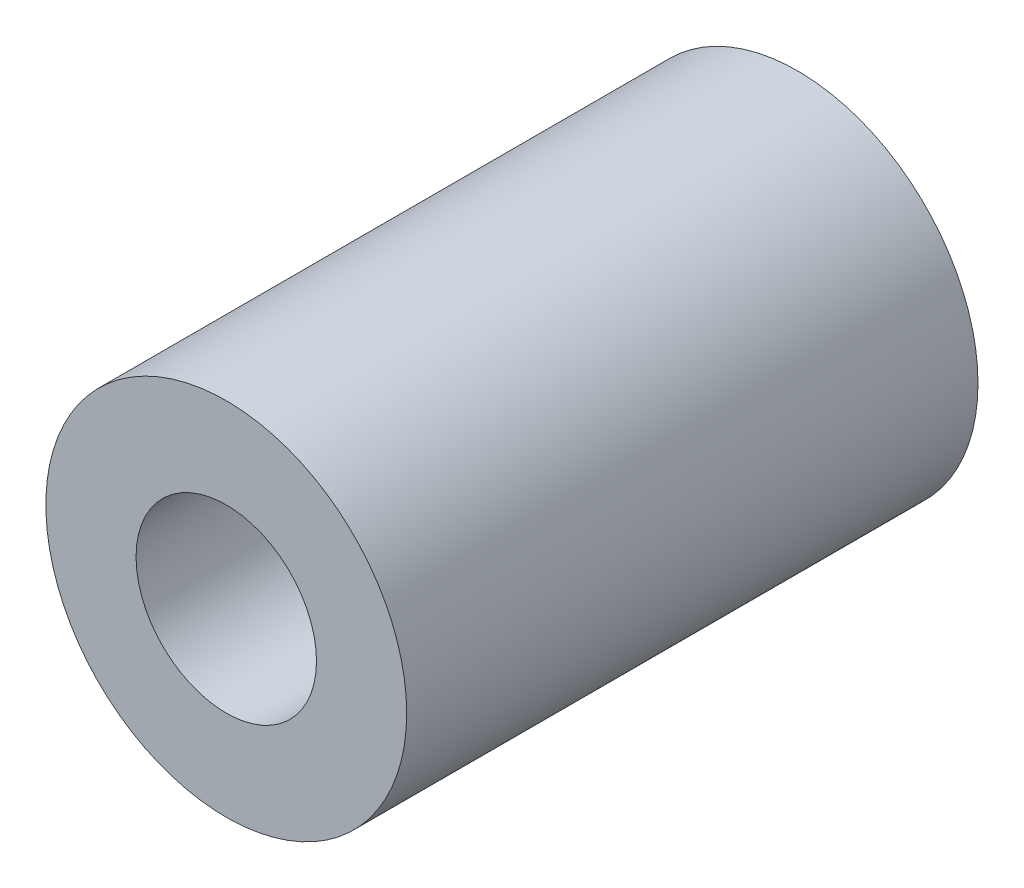
ISO-10303-21;
HEADER;
FILE_DESCRIPTION(('STEP AP214'),'2;1');
FILE_NAME('part.step','',(''),(''),'','','');
FILE_SCHEMA(('AUTOMOTIVE_DESIGN { 1 0 10303 214 1 1 1 1 }'));
ENDSEC;
DATA;
#1=APPLICATION_CONTEXT('core data for automotive mechanical design processes');
#2=APPLICATION_PROTOCOL_DEFINITION('international standard','automotive_design',2000,#1);
#3=PRODUCT_CONTEXT('',#1,'mechanical');
#4=PRODUCT('Part','Part','',(#3));
#5=PRODUCT_RELATED_PRODUCT_CATEGORY('part','',(#4));
#6=PRODUCT_DEFINITION_FORMATION('','',#4);
#7=PRODUCT_DEFINITION_CONTEXT('part definition',#1,'design');
#8=PRODUCT_DEFINITION('design','',#6,#7);
#9=PRODUCT_DEFINITION_SHAPE('','',#8);
#10=(LENGTH_UNIT() NAMED_UNIT(*) SI_UNIT(.MILLI.,.METRE.));
#11=(NAMED_UNIT(*) PLANE_ANGLE_UNIT() SI_UNIT($,.RADIAN.));
#12=(NAMED_UNIT(*) SI_UNIT($,.STERADIAN.) SOLID_ANGLE_UNIT());
#13=UNCERTAINTY_MEASURE_WITH_UNIT(LENGTH_MEASURE(1.E-05),#10,'distance_accuracy_value','');
#14=(GEOMETRIC_REPRESENTATION_CONTEXT(3) GLOBAL_UNCERTAINTY_ASSIGNED_CONTEXT((#13)) GLOBAL_UNIT_ASSIGNED_CONTEXT((#10,
#11,#12)) REPRESENTATION_CONTEXT('',''));
#15=CARTESIAN_POINT('',(0.,0.,0.));
#16=DIRECTION('',(0.,0.,1.));
#17=DIRECTION('',(1.,0.,0.));
#18=AXIS2_PLACEMENT_3D('',#15,#16,#17);
#19=CARTESIAN_POINT('',(0.,0.,19.));
#20=DIRECTION('',(0.,0.,1.));
#21=DIRECTION('',(1.,0.,0.));
#22=AXIS2_PLACEMENT_3D('',#19,#20,#21);
#23=PLANE('',#22);
#24=CARTESIAN_POINT('',(0.,0.,19.));
#25=DIRECTION('',(0.,0.,1.));
#26=DIRECTION('',(1.,0.,0.));
#27=AXIS2_PLACEMENT_3D('',#24,#25,#26);
#28=CIRCLE('',#27,6.);
#29=CARTESIAN_POINT('',(6.,0.,19.));
#30=VERTEX_POINT('',#29);
#31=EDGE_CURVE('E10',#30,#30,#28,.T.);
#32=ORIENTED_EDGE('',*,*,#31,.T.);
#33=EDGE_LOOP('',(#32));
#34=FACE_BOUND('',#33,.T.);
#35=CARTESIAN_POINT('',(0.,0.,19.));
#36=DIRECTION('',(0.,0.,1.));
#37=DIRECTION('',(1.,0.,0.));
#38=AXIS2_PLACEMENT_3D('',#35,#36,#37);
#39=CIRCLE('',#38,3.);
#40=CARTESIAN_POINT('',(3.,0.,19.));
#41=VERTEX_POINT('',#40);
#42=EDGE_CURVE('E48',#41,#41,#39,.T.);
#43=ORIENTED_EDGE('',*,*,#42,.F.);
#44=EDGE_LOOP('',(#43));
#45=FACE_BOUND('',#44,.T.);
#46=ADVANCED_FACE('F37',(#34,#45),#23,.T.);
#47=CARTESIAN_POINT('',(0.,0.,0.));
#48=DIRECTION('',(0.,0.,1.));
#49=DIRECTION('',(1.,0.,0.));
#50=AXIS2_PLACEMENT_3D('',#47,#48,#49);
#51=PLANE('',#50);
#52=CARTESIAN_POINT('',(0.,0.,0.));
#53=DIRECTION('',(0.,0.,1.));
#54=DIRECTION('',(1.,0.,0.));
#55=AXIS2_PLACEMENT_3D('',#52,#53,#54);
#56=CIRCLE('',#55,6.);
#57=CARTESIAN_POINT('',(6.,0.,0.));
#58=VERTEX_POINT('',#57);
#59=EDGE_CURVE('E41',#58,#58,#56,.T.);
#60=ORIENTED_EDGE('',*,*,#59,.F.);
#61=EDGE_LOOP('',(#60));
#62=FACE_BOUND('',#61,.T.);
#63=CARTESIAN_POINT('',(0.,0.,0.));
#64=DIRECTION('',(0.,0.,1.));
#65=DIRECTION('',(1.,0.,0.));
#66=AXIS2_PLACEMENT_3D('',#63,#64,#65);
#67=CIRCLE('',#66,3.);
#68=CARTESIAN_POINT('',(3.,0.,0.));
#69=VERTEX_POINT('',#68);
#70=EDGE_CURVE('E50',#69,#69,#67,.T.);
#71=ORIENTED_EDGE('',*,*,#70,.T.);
#72=EDGE_LOOP('',(#71));
#73=FACE_BOUND('',#72,.T.);
#74=ADVANCED_FACE('F60',(#62,#73),#51,.F.);
#75=CARTESIAN_POINT('',(0.,0.,19.));
#76=DIRECTION('',(0.,0.,-1.));
#77=DIRECTION('',(-1.,0.,0.));
#78=AXIS2_PLACEMENT_3D('',#75,#76,#77);
#79=CYLINDRICAL_SURFACE('',#78,6.);
#80=ORIENTED_EDGE('',*,*,#31,.F.);
#81=EDGE_LOOP('',(#80));
#82=FACE_BOUND('',#81,.T.);
#83=ORIENTED_EDGE('',*,*,#59,.T.);
#84=EDGE_LOOP('',(#83));
#85=FACE_BOUND('',#84,.T.);
#86=ADVANCED_FACE('F39',(#82,#85),#79,.T.);
#87=CARTESIAN_POINT('',(0.,0.,19.));
#88=DIRECTION('',(0.,0.,-1.));
#89=DIRECTION('',(-1.,0.,0.));
#90=AXIS2_PLACEMENT_3D('',#87,#88,#89);
#91=CYLINDRICAL_SURFACE('',#90,3.);
#92=ORIENTED_EDGE('',*,*,#42,.T.);
#93=EDGE_LOOP('',(#92));
#94=FACE_BOUND('',#93,.T.);
#95=ORIENTED_EDGE('',*,*,#70,.F.);
#96=EDGE_LOOP('',(#95));
#97=FACE_BOUND('',#96,.T.);
#98=ADVANCED_FACE('F56',(#94,#97),#91,.F.);
#99=CLOSED_SHELL('',(#46,#74,#86,#98));
#100=MANIFOLD_SOLID_BREP('B2',#99);
#101=ADVANCED_BREP_SHAPE_REPRESENTATION('',(#18,#100),#14);
#102=SHAPE_DEFINITION_REPRESENTATION(#9,#101);
ENDSEC;
END-ISO-10303-21;
